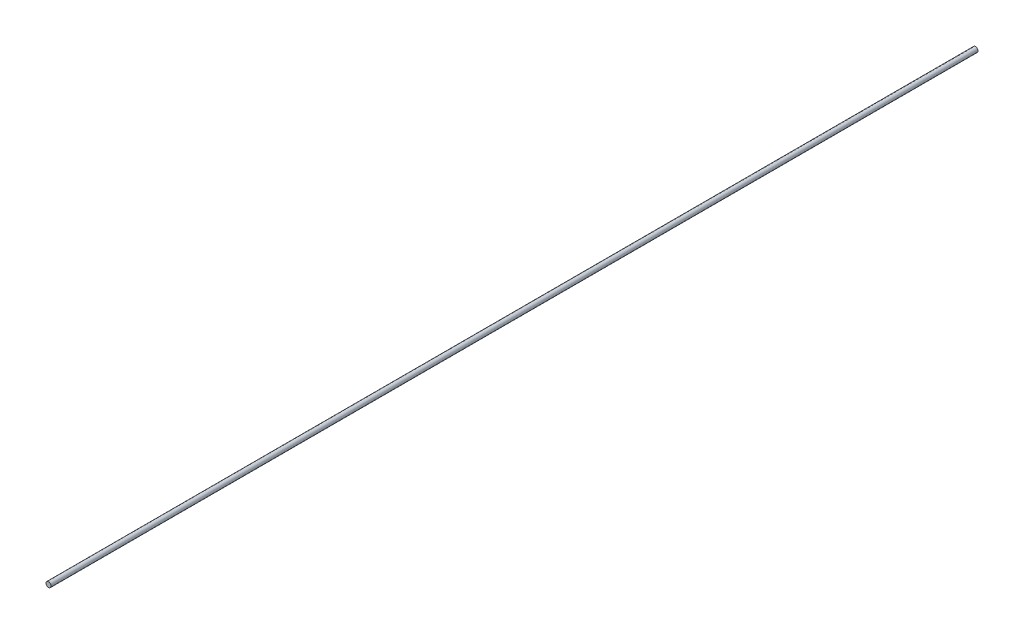
ISO-10303-21;
HEADER;
FILE_DESCRIPTION(('STEP AP214'),'2;1');
FILE_NAME('part.step','',(''),(''),'','','');
FILE_SCHEMA(('AUTOMOTIVE_DESIGN { 1 0 10303 214 1 1 1 1 }'));
ENDSEC;
DATA;
#1=APPLICATION_CONTEXT('core data for automotive mechanical design processes');
#2=APPLICATION_PROTOCOL_DEFINITION('international standard','automotive_design',2000,#1);
#3=PRODUCT_CONTEXT('',#1,'mechanical');
#4=PRODUCT('Part','Part','',(#3));
#5=PRODUCT_RELATED_PRODUCT_CATEGORY('part','',(#4));
#6=PRODUCT_DEFINITION_FORMATION('','',#4);
#7=PRODUCT_DEFINITION_CONTEXT('part definition',#1,'design');
#8=PRODUCT_DEFINITION('design','',#6,#7);
#9=PRODUCT_DEFINITION_SHAPE('','',#8);
#10=(LENGTH_UNIT() NAMED_UNIT(*) SI_UNIT(.MILLI.,.METRE.));
#11=(NAMED_UNIT(*) PLANE_ANGLE_UNIT() SI_UNIT($,.RADIAN.));
#12=(NAMED_UNIT(*) SI_UNIT($,.STERADIAN.) SOLID_ANGLE_UNIT());
#13=UNCERTAINTY_MEASURE_WITH_UNIT(LENGTH_MEASURE(1.E-05),#10,'distance_accuracy_value','');
#14=(GEOMETRIC_REPRESENTATION_CONTEXT(3) GLOBAL_UNCERTAINTY_ASSIGNED_CONTEXT((#13)) GLOBAL_UNIT_ASSIGNED_CONTEXT((#10,
#11,#12)) REPRESENTATION_CONTEXT('',''));
#15=CARTESIAN_POINT('',(0.,0.,0.));
#16=DIRECTION('',(0.,0.,1.));
#17=DIRECTION('',(1.,0.,0.));
#18=AXIS2_PLACEMENT_3D('',#15,#16,#17);
#19=CARTESIAN_POINT('',(0.,0.,460.));
#20=DIRECTION('',(0.,0.,-1.));
#21=DIRECTION('',(-1.,0.,0.));
#22=AXIS2_PLACEMENT_3D('',#19,#20,#21);
#23=CYLINDRICAL_SURFACE('',#22,1.25);
#24=CARTESIAN_POINT('',(0.,0.,460.));
#25=DIRECTION('',(0.,0.,1.));
#26=DIRECTION('',(1.,0.,0.));
#27=AXIS2_PLACEMENT_3D('',#24,#25,#26);
#28=CIRCLE('',#27,1.25);
#29=CARTESIAN_POINT('',(1.25,0.,460.));
#30=VERTEX_POINT('',#29);
#31=EDGE_CURVE('E10',#30,#30,#28,.T.);
#32=ORIENTED_EDGE('',*,*,#31,.F.);
#33=EDGE_LOOP('',(#32));
#34=FACE_BOUND('',#33,.T.);
#35=CARTESIAN_POINT('',(0.,0.,0.));
#36=DIRECTION('',(0.,0.,1.));
#37=DIRECTION('',(1.,0.,0.));
#38=AXIS2_PLACEMENT_3D('',#35,#36,#37);
#39=CIRCLE('',#38,1.25);
#40=CARTESIAN_POINT('',(1.25,0.,0.));
#41=VERTEX_POINT('',#40);
#42=EDGE_CURVE('E40',#41,#41,#39,.T.);
#43=ORIENTED_EDGE('',*,*,#42,.T.);
#44=EDGE_LOOP('',(#43));
#45=FACE_BOUND('',#44,.T.);
#46=ADVANCED_FACE('F37',(#34,#45),#23,.T.);
#47=CARTESIAN_POINT('',(0.,0.,460.));
#48=DIRECTION('',(0.,0.,1.));
#49=DIRECTION('',(1.,0.,0.));
#50=AXIS2_PLACEMENT_3D('',#47,#48,#49);
#51=PLANE('',#50);
#52=ORIENTED_EDGE('',*,*,#31,.T.);
#53=EDGE_LOOP('',(#52));
#54=FACE_BOUND('',#53,.T.);
#55=ADVANCED_FACE('F54',(#54),#51,.T.);
#56=CARTESIAN_POINT('',(0.,0.,0.));
#57=DIRECTION('',(0.,0.,1.));
#58=DIRECTION('',(1.,0.,0.));
#59=AXIS2_PLACEMENT_3D('',#56,#57,#58);
#60=PLANE('',#59);
#61=ORIENTED_EDGE('',*,*,#42,.F.);
#62=EDGE_LOOP('',(#61));
#63=FACE_BOUND('',#62,.T.);
#64=ADVANCED_FACE('F52',(#63),#60,.F.);
#65=CLOSED_SHELL('',(#46,#55,#64));
#66=MANIFOLD_SOLID_BREP('B2',#65);
#67=ADVANCED_BREP_SHAPE_REPRESENTATION('',(#18,#66),#14);
#68=SHAPE_DEFINITION_REPRESENTATION(#9,#67);
ENDSEC;
END-ISO-10303-21;
